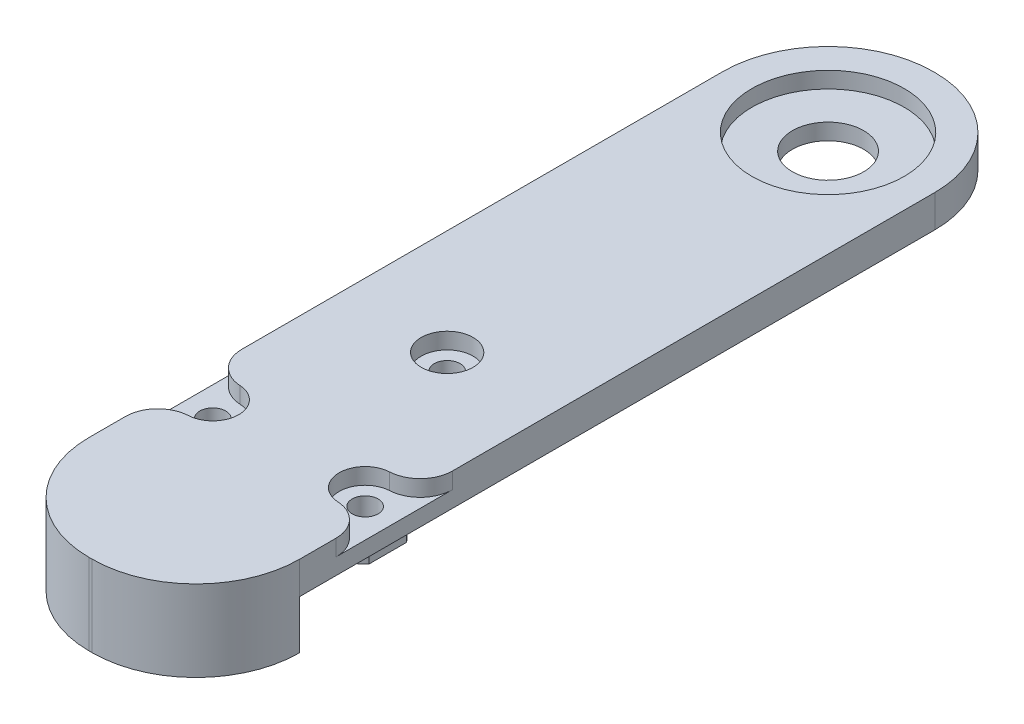
ISO-10303-21;
HEADER;
FILE_DESCRIPTION(('STEP AP214'),'2;1');
FILE_NAME('part.step','',(''),(''),'','','');
FILE_SCHEMA(('AUTOMOTIVE_DESIGN { 1 0 10303 214 1 1 1 1 }'));
ENDSEC;
DATA;
#1=APPLICATION_CONTEXT('core data for automotive mechanical design processes');
#2=APPLICATION_PROTOCOL_DEFINITION('international standard','automotive_design',2000,#1);
#3=PRODUCT_CONTEXT('',#1,'mechanical');
#4=PRODUCT('Part','Part','',(#3));
#5=PRODUCT_RELATED_PRODUCT_CATEGORY('part','',(#4));
#6=PRODUCT_DEFINITION_FORMATION('','',#4);
#7=PRODUCT_DEFINITION_CONTEXT('part definition',#1,'design');
#8=PRODUCT_DEFINITION('design','',#6,#7);
#9=PRODUCT_DEFINITION_SHAPE('','',#8);
#10=(LENGTH_UNIT() NAMED_UNIT(*) SI_UNIT(.MILLI.,.METRE.));
#11=(NAMED_UNIT(*) PLANE_ANGLE_UNIT() SI_UNIT($,.RADIAN.));
#12=(NAMED_UNIT(*) SI_UNIT($,.STERADIAN.) SOLID_ANGLE_UNIT());
#13=UNCERTAINTY_MEASURE_WITH_UNIT(LENGTH_MEASURE(1.E-05),#10,'distance_accuracy_value','');
#14=(GEOMETRIC_REPRESENTATION_CONTEXT(3) GLOBAL_UNCERTAINTY_ASSIGNED_CONTEXT((#13)) GLOBAL_UNIT_ASSIGNED_CONTEXT((#10,
#11,#12)) REPRESENTATION_CONTEXT('',''));
#15=CARTESIAN_POINT('',(0.,0.,0.));
#16=DIRECTION('',(0.,0.,1.));
#17=DIRECTION('',(1.,0.,0.));
#18=AXIS2_PLACEMENT_3D('',#15,#16,#17);
#19=CARTESIAN_POINT('',(23.5,-4.,68.8047840861343));
#20=DIRECTION('',(0.,1.,0.));
#21=DIRECTION('',(0.,0.,1.));
#22=AXIS2_PLACEMENT_3D('',#19,#20,#21);
#23=CYLINDRICAL_SURFACE('',#22,4.);
#24=CARTESIAN_POINT('',(23.5,-4.,68.8047840861343));
#25=DIRECTION('',(0.,-1.,0.));
#26=DIRECTION('',(0.,0.,1.));
#27=AXIS2_PLACEMENT_3D('',#24,#25,#26);
#28=CIRCLE('',#27,4.);
#29=CARTESIAN_POINT('',(23.5,-4.,72.8047840861343));
#30=VERTEX_POINT('',#29);
#31=EDGE_CURVE('E241',#30,#30,#28,.T.);
#32=ORIENTED_EDGE('',*,*,#31,.T.);
#33=EDGE_LOOP('',(#32));
#34=FACE_BOUND('',#33,.T.);
#35=CARTESIAN_POINT('',(23.5,5.,68.8047840861343));
#36=DIRECTION('',(0.,1.,0.));
#37=DIRECTION('',(0.,0.,1.));
#38=AXIS2_PLACEMENT_3D('',#35,#36,#37);
#39=CIRCLE('',#38,4.);
#40=CARTESIAN_POINT('',(23.5,5.,72.8047840861343));
#41=VERTEX_POINT('',#40);
#42=EDGE_CURVE('E403',#41,#41,#39,.T.);
#43=ORIENTED_EDGE('',*,*,#42,.T.);
#44=EDGE_LOOP('',(#43));
#45=FACE_BOUND('',#44,.T.);
#46=ADVANCED_FACE('F39',(#34,#45),#23,.F.);
#47=CARTESIAN_POINT('',(0.,10.,20.));
#48=DIRECTION('',(0.,-1.,0.));
#49=DIRECTION('',(0.,0.,-1.));
#50=AXIS2_PLACEMENT_3D('',#47,#48,#49);
#51=CYLINDRICAL_SURFACE('',#50,4.);
#52=CARTESIAN_POINT('',(0.,0.,20.));
#53=DIRECTION('',(0.,-1.,0.));
#54=DIRECTION('',(0.,0.,-1.));
#55=AXIS2_PLACEMENT_3D('',#52,#53,#54);
#56=CIRCLE('',#55,4.);
#57=CARTESIAN_POINT('',(0.,0.,16.));
#58=VERTEX_POINT('',#57);
#59=EDGE_CURVE('E236',#58,#58,#56,.T.);
#60=ORIENTED_EDGE('',*,*,#59,.T.);
#61=EDGE_LOOP('',(#60));
#62=FACE_BOUND('',#61,.T.);
#63=CARTESIAN_POINT('',(0.,5.,20.));
#64=DIRECTION('',(0.,1.,0.));
#65=DIRECTION('',(0.,0.,1.));
#66=AXIS2_PLACEMENT_3D('',#63,#64,#65);
#67=CIRCLE('',#66,4.);
#68=CARTESIAN_POINT('',(0.,5.,24.));
#69=VERTEX_POINT('',#68);
#70=EDGE_CURVE('E399',#69,#69,#67,.F.);
#71=ORIENTED_EDGE('',*,*,#70,.F.);
#72=EDGE_LOOP('',(#71));
#73=FACE_BOUND('',#72,.T.);
#74=ADVANCED_FACE('F576',(#62,#73),#51,.F.);
#75=CARTESIAN_POINT('',(0.,0.,-97.5));
#76=DIRECTION('',(0.,1.,0.));
#77=DIRECTION('',(0.,0.,1.));
#78=AXIS2_PLACEMENT_3D('',#75,#76,#77);
#79=PLANE('',#78);
#80=CARTESIAN_POINT('',(0.,0.,-97.5));
#81=DIRECTION('',(0.,1.,0.));
#82=DIRECTION('',(0.,0.,1.));
#83=AXIS2_PLACEMENT_3D('',#80,#81,#82);
#84=CIRCLE('',#83,11.);
#85=CARTESIAN_POINT('',(0.,0.,-86.5));
#86=VERTEX_POINT('',#85);
#87=EDGE_CURVE('E309',#86,#86,#84,.T.);
#88=ORIENTED_EDGE('',*,*,#87,.T.);
#89=EDGE_LOOP('',(#88));
#90=FACE_BOUND('',#89,.T.);
#91=CARTESIAN_POINT('',(0.,0.,48.75));
#92=DIRECTION('',(0.,-1.,0.));
#93=DIRECTION('',(0.,0.,-1.));
#94=AXIS2_PLACEMENT_3D('',#91,#92,#93);
#95=CIRCLE('',#94,8.);
#96=CARTESIAN_POINT('',(0.,0.,40.75));
#97=VERTEX_POINT('',#96);
#98=EDGE_CURVE('E300',#97,#97,#95,.T.);
#99=ORIENTED_EDGE('',*,*,#98,.F.);
#100=EDGE_LOOP('',(#99));
#101=FACE_BOUND('',#100,.T.);
#102=CARTESIAN_POINT('',(-23.5,0.,68.8047840861343));
#103=DIRECTION('',(0.,-1.,0.));
#104=DIRECTION('',(0.,0.,-1.));
#105=AXIS2_PLACEMENT_3D('',#102,#103,#104);
#106=CIRCLE('',#105,9.09814427655968);
#107=CARTESIAN_POINT('',(-30.5,0.,62.9930520485146));
#108=VERTEX_POINT('',#107);
#109=CARTESIAN_POINT('',(-30.5,0.,74.6165161237541));
#110=VERTEX_POINT('',#109);
#111=EDGE_CURVE('E277',#108,#110,#106,.T.);
#112=ORIENTED_EDGE('',*,*,#111,.F.);
#113=DIRECTION('',(0.,0.,-1.));
#114=VECTOR('',#113,1.);
#115=CARTESIAN_POINT('',(-30.5,0.,74.6165161237541));
#116=LINE('',#115,#114);
#117=EDGE_CURVE('E283',#110,#108,#116,.T.);
#118=ORIENTED_EDGE('',*,*,#117,.F.);
#119=EDGE_LOOP('',(#112,#118));
#120=FACE_BOUND('',#119,.T.);
#121=CARTESIAN_POINT('',(23.5,0.,68.8047840861343));
#122=DIRECTION('',(0.,-1.,0.));
#123=DIRECTION('',(0.,0.,1.));
#124=AXIS2_PLACEMENT_3D('',#121,#122,#123);
#125=CIRCLE('',#124,9.09814427655968);
#126=CARTESIAN_POINT('',(30.5,0.,74.6165161237541));
#127=VERTEX_POINT('',#126);
#128=CARTESIAN_POINT('',(30.5,0.,62.9930520485146));
#129=VERTEX_POINT('',#128);
#130=EDGE_CURVE('E250',#127,#129,#125,.T.);
#131=ORIENTED_EDGE('',*,*,#130,.F.);
#132=DIRECTION('',(0.,0.,1.));
#133=VECTOR('',#132,1.);
#134=CARTESIAN_POINT('',(30.5,0.,74.6165161237541));
#135=LINE('',#134,#133);
#136=EDGE_CURVE('E256',#129,#127,#135,.T.);
#137=ORIENTED_EDGE('',*,*,#136,.F.);
#138=EDGE_LOOP('',(#131,#137));
#139=FACE_BOUND('',#138,.T.);
#140=ORIENTED_EDGE('',*,*,#59,.F.);
#141=EDGE_LOOP('',(#140));
#142=FACE_BOUND('',#141,.T.);
#143=DIRECTION('',(1.,0.,0.));
#144=VECTOR('',#143,1.);
#145=CARTESIAN_POINT('',(-32.5,0.,97.9999999999998));
#146=LINE('',#145,#144);
#147=CARTESIAN_POINT('',(-32.5,0.,97.9999999999998));
#148=VERTEX_POINT('',#147);
#149=CARTESIAN_POINT('',(-30.5,0.,97.9999999999998));
#150=VERTEX_POINT('',#149);
#151=EDGE_CURVE('E412',#148,#150,#146,.T.);
#152=ORIENTED_EDGE('',*,*,#151,.F.);
#153=DIRECTION('',(0.,0.,1.));
#154=VECTOR('',#153,1.);
#155=CARTESIAN_POINT('',(-32.5,0.,-97.4999999999998));
#156=LINE('',#155,#154);
#157=CARTESIAN_POINT('',(-32.5,0.,-97.4999999999998));
#158=VERTEX_POINT('',#157);
#159=EDGE_CURVE('E359',#158,#148,#156,.T.);
#160=ORIENTED_EDGE('',*,*,#159,.F.);
#161=CARTESIAN_POINT('',(0.,0.,-97.5));
#162=DIRECTION('',(0.,1.,0.));
#163=DIRECTION('',(0.,0.,1.));
#164=AXIS2_PLACEMENT_3D('',#161,#162,#163);
#165=CIRCLE('',#164,32.5);
#166=CARTESIAN_POINT('',(2.0122792321331E-13,0.,-130.));
#167=VERTEX_POINT('',#166);
#168=EDGE_CURVE('E321',#167,#158,#165,.T.);
#169=ORIENTED_EDGE('',*,*,#168,.F.);
#170=DIRECTION('',(-1.,0.,0.));
#171=VECTOR('',#170,1.);
#172=CARTESIAN_POINT('',(2.0122792321331E-13,0.,-130.));
#173=LINE('',#172,#171);
#174=CARTESIAN_POINT('',(0.499999999999758,0.,-130.));
#175=VERTEX_POINT('',#174);
#176=EDGE_CURVE('E330',#175,#167,#173,.T.);
#177=ORIENTED_EDGE('',*,*,#176,.F.);
#178=CARTESIAN_POINT('',(0.49999999999998,0.,-98.));
#179=DIRECTION('',(0.,1.,0.));
#180=DIRECTION('',(0.,0.,-1.));
#181=AXIS2_PLACEMENT_3D('',#178,#179,#180);
#182=CIRCLE('',#181,32.);
#183=CARTESIAN_POINT('',(32.5,0.,-97.9999999999998));
#184=VERTEX_POINT('',#183);
#185=EDGE_CURVE('E366',#184,#175,#182,.T.);
#186=ORIENTED_EDGE('',*,*,#185,.F.);
#187=DIRECTION('',(0.,0.,-1.));
#188=VECTOR('',#187,1.);
#189=CARTESIAN_POINT('',(32.5,0.,-97.9999999999998));
#190=LINE('',#189,#188);
#191=CARTESIAN_POINT('',(32.5,0.,97.9999999999998));
#192=VERTEX_POINT('',#191);
#193=EDGE_CURVE('E363',#192,#184,#190,.T.);
#194=ORIENTED_EDGE('',*,*,#193,.F.);
#195=DIRECTION('',(1.,0.,0.));
#196=VECTOR('',#195,1.);
#197=CARTESIAN_POINT('',(30.5,0.,97.9999999999998));
#198=LINE('',#197,#196);
#199=CARTESIAN_POINT('',(30.5,0.,97.9999999999998));
#200=VERTEX_POINT('',#199);
#201=EDGE_CURVE('E228',#200,#192,#198,.T.);
#202=ORIENTED_EDGE('',*,*,#201,.F.);
#203=CARTESIAN_POINT('',(0.500000000000014,0.,98.));
#204=DIRECTION('',(0.,1.,0.));
#205=DIRECTION('',(0.,0.,-1.));
#206=AXIS2_PLACEMENT_3D('',#203,#204,#205);
#207=CIRCLE('',#206,30.);
#208=CARTESIAN_POINT('',(0.499999999999805,0.,128.));
#209=VERTEX_POINT('',#208);
#210=EDGE_CURVE('E535',#209,#200,#207,.T.);
#211=ORIENTED_EDGE('',*,*,#210,.F.);
#212=DIRECTION('',(1.,0.,0.));
#213=VECTOR('',#212,1.);
#214=CARTESIAN_POINT('',(-0.499999999999772,0.,128.));
#215=LINE('',#214,#213);
#216=CARTESIAN_POINT('',(-0.499999999999772,0.,128.));
#217=VERTEX_POINT('',#216);
#218=EDGE_CURVE('E532',#217,#209,#215,.T.);
#219=ORIENTED_EDGE('',*,*,#218,.F.);
#220=CARTESIAN_POINT('',(-0.499999999999994,0.,98.));
#221=DIRECTION('',(0.,1.,0.));
#222=DIRECTION('',(0.,0.,-1.));
#223=AXIS2_PLACEMENT_3D('',#220,#221,#222);
#224=CIRCLE('',#223,30.);
#225=EDGE_CURVE('E529',#150,#217,#224,.T.);
#226=ORIENTED_EDGE('',*,*,#225,.F.);
#227=EDGE_LOOP('',(#152,#160,#169,#177,#186,#194,#202,#211,#219,#226));
#228=FACE_BOUND('',#227,.T.);
#229=ADVANCED_FACE('F490',(#90,#101,#120,#139,#142,#228),#79,.F.);
#230=CARTESIAN_POINT('',(0.,10.,-97.5));
#231=DIRECTION('',(0.,-1.,0.));
#232=DIRECTION('',(0.,0.,-1.));
#233=AXIS2_PLACEMENT_3D('',#230,#231,#232);
#234=CYLINDRICAL_SURFACE('',#233,32.5);
#235=ORIENTED_EDGE('',*,*,#168,.T.);
#236=DIRECTION('',(0.,-1.,0.));
#237=VECTOR('',#236,1.);
#238=CARTESIAN_POINT('',(-32.5,10.,-97.4999999999998));
#239=LINE('',#238,#237);
#240=CARTESIAN_POINT('',(-32.5,10.,-97.4999999999998));
#241=VERTEX_POINT('',#240);
#242=EDGE_CURVE('E394',#241,#158,#239,.T.);
#243=ORIENTED_EDGE('',*,*,#242,.F.);
#244=CARTESIAN_POINT('',(0.,10.,-97.5));
#245=DIRECTION('',(0.,1.,0.));
#246=DIRECTION('',(0.,0.,1.));
#247=AXIS2_PLACEMENT_3D('',#244,#245,#246);
#248=CIRCLE('',#247,32.5);
#249=CARTESIAN_POINT('',(2.0122792321331E-13,10.,-130.));
#250=VERTEX_POINT('',#249);
#251=EDGE_CURVE('E325',#250,#241,#248,.T.);
#252=ORIENTED_EDGE('',*,*,#251,.F.);
#253=DIRECTION('',(0.,-1.,0.));
#254=VECTOR('',#253,1.);
#255=CARTESIAN_POINT('',(2.0122792321331E-13,10.,-130.));
#256=LINE('',#255,#254);
#257=EDGE_CURVE('E355',#250,#167,#256,.T.);
#258=ORIENTED_EDGE('',*,*,#257,.T.);
#259=EDGE_LOOP('',(#235,#243,#252,#258));
#260=FACE_BOUND('',#259,.T.);
#261=ADVANCED_FACE('F639',(#260),#234,.T.);
#262=CARTESIAN_POINT('',(-32.5,10.,-97.4999999999998));
#263=DIRECTION('',(1.,0.,0.));
#264=DIRECTION('',(0.,0.,-1.));
#265=AXIS2_PLACEMENT_3D('',#262,#263,#264);
#266=PLANE('',#265);
#267=DIRECTION('',(0.,0.,1.));
#268=VECTOR('',#267,1.);
#269=CARTESIAN_POINT('',(-32.5,10.,-97.4999999999998));
#270=LINE('',#269,#268);
#271=CARTESIAN_POINT('',(-32.5,10.,86.7769848417458));
#272=VERTEX_POINT('',#271);
#273=CARTESIAN_POINT('',(-32.5,10.,97.9999999999998));
#274=VERTEX_POINT('',#273);
#275=EDGE_CURVE('E329',#272,#274,#270,.T.);
#276=ORIENTED_EDGE('',*,*,#275,.F.);
#277=DIRECTION('',(0.,1.,0.));
#278=VECTOR('',#277,1.);
#279=CARTESIAN_POINT('',(-32.5,10.,86.7769848417458));
#280=LINE('',#279,#278);
#281=CARTESIAN_POINT('',(-32.5,5.,86.7769848417458));
#282=VERTEX_POINT('',#281);
#283=EDGE_CURVE('E429',#272,#282,#280,.F.);
#284=ORIENTED_EDGE('',*,*,#283,.T.);
#285=DIRECTION('',(0.,0.,1.));
#286=VECTOR('',#285,1.);
#287=CARTESIAN_POINT('',(-32.5,5.,60.8047840861343));
#288=LINE('',#287,#286);
#289=CARTESIAN_POINT('',(-32.5,5.,50.8325833305229));
#290=VERTEX_POINT('',#289);
#291=EDGE_CURVE('E404',#290,#282,#288,.T.);
#292=ORIENTED_EDGE('',*,*,#291,.F.);
#293=DIRECTION('',(0.,1.,0.));
#294=VECTOR('',#293,1.);
#295=CARTESIAN_POINT('',(-32.5,10.,50.8325833305229));
#296=LINE('',#295,#294);
#297=CARTESIAN_POINT('',(-32.5,10.,50.8325833305229));
#298=VERTEX_POINT('',#297);
#299=EDGE_CURVE('E425',#290,#298,#296,.T.);
#300=ORIENTED_EDGE('',*,*,#299,.T.);
#301=EDGE_CURVE('E331',#241,#298,#270,.T.);
#302=ORIENTED_EDGE('',*,*,#301,.F.);
#303=ORIENTED_EDGE('',*,*,#242,.T.);
#304=ORIENTED_EDGE('',*,*,#159,.T.);
#305=DIRECTION('',(0.,-1.,0.));
#306=VECTOR('',#305,1.);
#307=CARTESIAN_POINT('',(-32.5,10.,97.9999999999998));
#308=LINE('',#307,#306);
#309=EDGE_CURVE('E234',#274,#148,#308,.T.);
#310=ORIENTED_EDGE('',*,*,#309,.F.);
#311=EDGE_LOOP('',(#276,#284,#292,#300,#302,#303,#304,#310));
#312=FACE_BOUND('',#311,.T.);
#313=ADVANCED_FACE('F512',(#312),#266,.F.);
#314=CARTESIAN_POINT('',(-0.499999999999994,10.,98.));
#315=DIRECTION('',(0.,-1.,0.));
#316=DIRECTION('',(0.,0.,-1.));
#317=AXIS2_PLACEMENT_3D('',#314,#315,#316);
#318=CYLINDRICAL_SURFACE('',#317,32.);
#319=ORIENTED_EDGE('',*,*,#309,.T.);
#320=DIRECTION('',(0.,1.,0.));
#321=VECTOR('',#320,1.);
#322=CARTESIAN_POINT('',(-32.5,-15.,97.9999999999998));
#323=LINE('',#322,#321);
#324=CARTESIAN_POINT('',(-32.5,-15.,97.9999999999998));
#325=VERTEX_POINT('',#324);
#326=EDGE_CURVE('E209',#325,#148,#323,.T.);
#327=ORIENTED_EDGE('',*,*,#326,.F.);
#328=CARTESIAN_POINT('',(-0.499999999999994,-15.,98.));
#329=DIRECTION('',(0.,-1.,0.));
#330=DIRECTION('',(0.,0.,-1.));
#331=AXIS2_PLACEMENT_3D('',#328,#329,#330);
#332=CIRCLE('',#331,32.);
#333=CARTESIAN_POINT('',(-0.499999999999758,-15.,130.));
#334=VERTEX_POINT('',#333);
#335=EDGE_CURVE('E217',#334,#325,#332,.T.);
#336=ORIENTED_EDGE('',*,*,#335,.F.);
#337=DIRECTION('',(0.,-1.,0.));
#338=VECTOR('',#337,1.);
#339=CARTESIAN_POINT('',(-0.499999999999758,10.,130.));
#340=LINE('',#339,#338);
#341=CARTESIAN_POINT('',(-0.499999999999758,10.,130.));
#342=VERTEX_POINT('',#341);
#343=EDGE_CURVE('E389',#342,#334,#340,.T.);
#344=ORIENTED_EDGE('',*,*,#343,.F.);
#345=CARTESIAN_POINT('',(-0.499999999999994,10.,98.));
#346=DIRECTION('',(0.,1.,0.));
#347=DIRECTION('',(0.,0.,1.));
#348=AXIS2_PLACEMENT_3D('',#345,#346,#347);
#349=CIRCLE('',#348,32.);
#350=EDGE_CURVE('E335',#274,#342,#349,.T.);
#351=ORIENTED_EDGE('',*,*,#350,.F.);
#352=EDGE_LOOP('',(#319,#327,#336,#344,#351));
#353=FACE_BOUND('',#352,.T.);
#354=ADVANCED_FACE('F231',(#353),#318,.T.);
#355=CARTESIAN_POINT('',(-0.499999999999758,10.,130.));
#356=DIRECTION('',(0.,0.,-1.));
#357=DIRECTION('',(-1.,0.,0.));
#358=AXIS2_PLACEMENT_3D('',#355,#356,#357);
#359=PLANE('',#358);
#360=ORIENTED_EDGE('',*,*,#343,.T.);
#361=DIRECTION('',(-1.,0.,0.));
#362=VECTOR('',#361,1.);
#363=CARTESIAN_POINT('',(-0.499999999999758,-15.,130.));
#364=LINE('',#363,#362);
#365=CARTESIAN_POINT('',(0.499999999999787,-15.,130.));
#366=VERTEX_POINT('',#365);
#367=EDGE_CURVE('E224',#366,#334,#364,.T.);
#368=ORIENTED_EDGE('',*,*,#367,.F.);
#369=DIRECTION('',(0.,-1.,0.));
#370=VECTOR('',#369,1.);
#371=CARTESIAN_POINT('',(0.499999999999787,10.,130.));
#372=LINE('',#371,#370);
#373=CARTESIAN_POINT('',(0.499999999999787,10.,130.));
#374=VERTEX_POINT('',#373);
#375=EDGE_CURVE('E386',#374,#366,#372,.T.);
#376=ORIENTED_EDGE('',*,*,#375,.F.);
#377=DIRECTION('',(1.,0.,0.));
#378=VECTOR('',#377,1.);
#379=CARTESIAN_POINT('',(-0.499999999999758,10.,130.));
#380=LINE('',#379,#378);
#381=EDGE_CURVE('E338',#342,#374,#380,.T.);
#382=ORIENTED_EDGE('',*,*,#381,.F.);
#383=EDGE_LOOP('',(#360,#368,#376,#382));
#384=FACE_BOUND('',#383,.T.);
#385=ADVANCED_FACE('F514',(#384),#359,.F.);
#386=CARTESIAN_POINT('',(0.500000000000014,10.,98.));
#387=DIRECTION('',(0.,-1.,0.));
#388=DIRECTION('',(0.,0.,-1.));
#389=AXIS2_PLACEMENT_3D('',#386,#387,#388);
#390=CYLINDRICAL_SURFACE('',#389,32.);
#391=ORIENTED_EDGE('',*,*,#375,.T.);
#392=CARTESIAN_POINT('',(0.500000000000014,-15.,98.));
#393=DIRECTION('',(0.,-1.,0.));
#394=DIRECTION('',(0.,0.,-1.));
#395=AXIS2_PLACEMENT_3D('',#392,#393,#394);
#396=CIRCLE('',#395,32.);
#397=CARTESIAN_POINT('',(32.5,-15.,97.9999999999998));
#398=VERTEX_POINT('',#397);
#399=EDGE_CURVE('E515',#398,#366,#396,.T.);
#400=ORIENTED_EDGE('',*,*,#399,.F.);
#401=DIRECTION('',(0.,1.,0.));
#402=VECTOR('',#401,1.);
#403=CARTESIAN_POINT('',(32.5,-15.,97.9999999999998));
#404=LINE('',#403,#402);
#405=EDGE_CURVE('E484',#398,#192,#404,.T.);
#406=ORIENTED_EDGE('',*,*,#405,.T.);
#407=DIRECTION('',(0.,-1.,0.));
#408=VECTOR('',#407,1.);
#409=CARTESIAN_POINT('',(32.5,10.,97.9999999999998));
#410=LINE('',#409,#408);
#411=CARTESIAN_POINT('',(32.5,10.,97.9999999999998));
#412=VERTEX_POINT('',#411);
#413=EDGE_CURVE('E382',#412,#192,#410,.T.);
#414=ORIENTED_EDGE('',*,*,#413,.F.);
#415=CARTESIAN_POINT('',(0.500000000000014,10.,98.));
#416=DIRECTION('',(0.,1.,0.));
#417=DIRECTION('',(0.,0.,1.));
#418=AXIS2_PLACEMENT_3D('',#415,#416,#417);
#419=CIRCLE('',#418,32.);
#420=EDGE_CURVE('E341',#374,#412,#419,.T.);
#421=ORIENTED_EDGE('',*,*,#420,.F.);
#422=EDGE_LOOP('',(#391,#400,#406,#414,#421));
#423=FACE_BOUND('',#422,.T.);
#424=ADVANCED_FACE('F481',(#423),#390,.T.);
#425=CARTESIAN_POINT('',(32.5,10.,-97.9999999999998));
#426=DIRECTION('',(-1.,0.,0.));
#427=DIRECTION('',(0.,0.,1.));
#428=AXIS2_PLACEMENT_3D('',#425,#426,#427);
#429=PLANE('',#428);
#430=DIRECTION('',(0.,0.,-1.));
#431=VECTOR('',#430,1.);
#432=CARTESIAN_POINT('',(32.5,5.,60.8047840861343));
#433=LINE('',#432,#431);
#434=CARTESIAN_POINT('',(32.5,5.,86.7769848417458));
#435=VERTEX_POINT('',#434);
#436=CARTESIAN_POINT('',(32.5,5.,50.8325833305229));
#437=VERTEX_POINT('',#436);
#438=EDGE_CURVE('E464',#435,#437,#433,.T.);
#439=ORIENTED_EDGE('',*,*,#438,.F.);
#440=DIRECTION('',(0.,1.,0.));
#441=VECTOR('',#440,1.);
#442=CARTESIAN_POINT('',(32.5,10.,86.7769848417458));
#443=LINE('',#442,#441);
#444=CARTESIAN_POINT('',(32.5,10.,86.7769848417458));
#445=VERTEX_POINT('',#444);
#446=EDGE_CURVE('E444',#435,#445,#443,.T.);
#447=ORIENTED_EDGE('',*,*,#446,.T.);
#448=DIRECTION('',(0.,0.,-1.));
#449=VECTOR('',#448,1.);
#450=CARTESIAN_POINT('',(32.5,10.,-97.9999999999998));
#451=LINE('',#450,#449);
#452=EDGE_CURVE('E345',#412,#445,#451,.T.);
#453=ORIENTED_EDGE('',*,*,#452,.F.);
#454=ORIENTED_EDGE('',*,*,#413,.T.);
#455=ORIENTED_EDGE('',*,*,#193,.T.);
#456=DIRECTION('',(0.,-1.,0.));
#457=VECTOR('',#456,1.);
#458=CARTESIAN_POINT('',(32.5,10.,-97.9999999999998));
#459=LINE('',#458,#457);
#460=CARTESIAN_POINT('',(32.5,10.,-97.9999999999998));
#461=VERTEX_POINT('',#460);
#462=EDGE_CURVE('E378',#461,#184,#459,.T.);
#463=ORIENTED_EDGE('',*,*,#462,.F.);
#464=CARTESIAN_POINT('',(32.5,10.,50.8325833305229));
#465=VERTEX_POINT('',#464);
#466=EDGE_CURVE('E344',#465,#461,#451,.T.);
#467=ORIENTED_EDGE('',*,*,#466,.F.);
#468=DIRECTION('',(0.,1.,0.));
#469=VECTOR('',#468,1.);
#470=CARTESIAN_POINT('',(32.5,10.,50.8325833305229));
#471=LINE('',#470,#469);
#472=EDGE_CURVE('E440',#465,#437,#471,.F.);
#473=ORIENTED_EDGE('',*,*,#472,.T.);
#474=EDGE_LOOP('',(#439,#447,#453,#454,#455,#463,#467,#473));
#475=FACE_BOUND('',#474,.T.);
#476=ADVANCED_FACE('F470',(#475),#429,.F.);
#477=CARTESIAN_POINT('',(0.49999999999998,10.,-98.));
#478=DIRECTION('',(0.,-1.,0.));
#479=DIRECTION('',(0.,0.,-1.));
#480=AXIS2_PLACEMENT_3D('',#477,#478,#479);
#481=CYLINDRICAL_SURFACE('',#480,32.);
#482=ORIENTED_EDGE('',*,*,#185,.T.);
#483=DIRECTION('',(0.,-1.,0.));
#484=VECTOR('',#483,1.);
#485=CARTESIAN_POINT('',(0.499999999999758,10.,-130.));
#486=LINE('',#485,#484);
#487=CARTESIAN_POINT('',(0.499999999999758,10.,-130.));
#488=VERTEX_POINT('',#487);
#489=EDGE_CURVE('E374',#488,#175,#486,.T.);
#490=ORIENTED_EDGE('',*,*,#489,.F.);
#491=CARTESIAN_POINT('',(0.49999999999998,10.,-98.));
#492=DIRECTION('',(0.,1.,0.));
#493=DIRECTION('',(0.,0.,-1.));
#494=AXIS2_PLACEMENT_3D('',#491,#492,#493);
#495=CIRCLE('',#494,32.);
#496=EDGE_CURVE('E349',#461,#488,#495,.T.);
#497=ORIENTED_EDGE('',*,*,#496,.F.);
#498=ORIENTED_EDGE('',*,*,#462,.T.);
#499=EDGE_LOOP('',(#482,#490,#497,#498));
#500=FACE_BOUND('',#499,.T.);
#501=ADVANCED_FACE('F496',(#500),#481,.T.);
#502=CARTESIAN_POINT('',(2.0122792321331E-13,10.,-130.));
#503=DIRECTION('',(0.,0.,1.));
#504=DIRECTION('',(1.,0.,0.));
#505=AXIS2_PLACEMENT_3D('',#502,#503,#504);
#506=PLANE('',#505);
#507=ORIENTED_EDGE('',*,*,#176,.T.);
#508=ORIENTED_EDGE('',*,*,#257,.F.);
#509=DIRECTION('',(-1.,0.,0.));
#510=VECTOR('',#509,1.);
#511=CARTESIAN_POINT('',(2.0122792321331E-13,10.,-130.));
#512=LINE('',#511,#510);
#513=EDGE_CURVE('E352',#488,#250,#512,.T.);
#514=ORIENTED_EDGE('',*,*,#513,.F.);
#515=ORIENTED_EDGE('',*,*,#489,.T.);
#516=EDGE_LOOP('',(#507,#508,#514,#515));
#517=FACE_BOUND('',#516,.T.);
#518=ADVANCED_FACE('F500',(#517),#506,.F.);
#519=CARTESIAN_POINT('',(0.,10.,-97.5));
#520=DIRECTION('',(0.,1.,0.));
#521=DIRECTION('',(0.,0.,1.));
#522=AXIS2_PLACEMENT_3D('',#519,#520,#521);
#523=PLANE('',#522);
#524=ORIENTED_EDGE('',*,*,#452,.T.);
#525=CARTESIAN_POINT('',(22.5,10.,86.7769848417458));
#526=DIRECTION('',(0.,1.,0.));
#527=DIRECTION('',(0.,0.,1.));
#528=AXIS2_PLACEMENT_3D('',#525,#526,#527);
#529=CIRCLE('',#528,10.);
#530=CARTESIAN_POINT('',(23.0555555555556,10.,76.7924288664061));
#531=VERTEX_POINT('',#530);
#532=EDGE_CURVE('E451',#445,#531,#529,.T.);
#533=ORIENTED_EDGE('',*,*,#532,.T.);
#534=CARTESIAN_POINT('',(23.5,10.,68.8047840861343));
#535=DIRECTION('',(0.,1.,0.));
#536=DIRECTION('',(0.,0.,1.));
#537=AXIS2_PLACEMENT_3D('',#534,#535,#536);
#538=CIRCLE('',#537,8.);
#539=CARTESIAN_POINT('',(23.0555555555556,10.,60.8171393058626));
#540=VERTEX_POINT('',#539);
#541=EDGE_CURVE('E675',#540,#531,#538,.T.);
#542=ORIENTED_EDGE('',*,*,#541,.F.);
#543=CARTESIAN_POINT('',(22.5,10.,50.8325833305229));
#544=DIRECTION('',(0.,1.,0.));
#545=DIRECTION('',(0.,0.,1.));
#546=AXIS2_PLACEMENT_3D('',#543,#544,#545);
#547=CIRCLE('',#546,10.);
#548=EDGE_CURVE('E448',#540,#465,#547,.T.);
#549=ORIENTED_EDGE('',*,*,#548,.T.);
#550=ORIENTED_EDGE('',*,*,#466,.T.);
#551=ORIENTED_EDGE('',*,*,#496,.T.);
#552=ORIENTED_EDGE('',*,*,#513,.T.);
#553=ORIENTED_EDGE('',*,*,#251,.T.);
#554=ORIENTED_EDGE('',*,*,#301,.T.);
#555=CARTESIAN_POINT('',(-22.5,10.,50.8325833305229));
#556=DIRECTION('',(0.,1.,0.));
#557=DIRECTION('',(0.,0.,1.));
#558=AXIS2_PLACEMENT_3D('',#555,#556,#557);
#559=CIRCLE('',#558,10.);
#560=CARTESIAN_POINT('',(-23.0555555555556,10.,60.8171393058626));
#561=VERTEX_POINT('',#560);
#562=EDGE_CURVE('E419',#298,#561,#559,.T.);
#563=ORIENTED_EDGE('',*,*,#562,.T.);
#564=CARTESIAN_POINT('',(-23.5,10.,68.8047840861343));
#565=DIRECTION('',(0.,1.,0.));
#566=DIRECTION('',(0.,0.,-1.));
#567=AXIS2_PLACEMENT_3D('',#564,#565,#566);
#568=CIRCLE('',#567,8.);
#569=CARTESIAN_POINT('',(-23.0555555555556,10.,76.7924288664061));
#570=VERTEX_POINT('',#569);
#571=EDGE_CURVE('E976',#570,#561,#568,.T.);
#572=ORIENTED_EDGE('',*,*,#571,.F.);
#573=CARTESIAN_POINT('',(-22.5,10.,86.7769848417458));
#574=DIRECTION('',(0.,1.,0.));
#575=DIRECTION('',(0.,0.,1.));
#576=AXIS2_PLACEMENT_3D('',#573,#574,#575);
#577=CIRCLE('',#576,10.);
#578=EDGE_CURVE('E422',#570,#272,#577,.T.);
#579=ORIENTED_EDGE('',*,*,#578,.T.);
#580=ORIENTED_EDGE('',*,*,#275,.T.);
#581=ORIENTED_EDGE('',*,*,#350,.T.);
#582=ORIENTED_EDGE('',*,*,#381,.T.);
#583=ORIENTED_EDGE('',*,*,#420,.T.);
#584=EDGE_LOOP('',(#524,#533,#542,#549,#550,#551,#552,#553,#554,#563,#572,#579,#580,#581,#582,#583));
#585=FACE_BOUND('',#584,.T.);
#586=CARTESIAN_POINT('',(0.,10.,20.));
#587=DIRECTION('',(0.,1.,0.));
#588=DIRECTION('',(0.,0.,1.));
#589=AXIS2_PLACEMENT_3D('',#586,#587,#588);
#590=CIRCLE('',#589,8.);
#591=CARTESIAN_POINT('',(0.,10.,28.));
#592=VERTEX_POINT('',#591);
#593=EDGE_CURVE('E683',#592,#592,#590,.T.);
#594=ORIENTED_EDGE('',*,*,#593,.F.);
#595=EDGE_LOOP('',(#594));
#596=FACE_BOUND('',#595,.T.);
#597=CARTESIAN_POINT('',(0.,10.,-97.5));
#598=DIRECTION('',(0.,1.,0.));
#599=DIRECTION('',(0.,0.,1.));
#600=AXIS2_PLACEMENT_3D('',#597,#598,#599);
#601=CIRCLE('',#600,23.5);
#602=CARTESIAN_POINT('',(0.,10.,-74.));
#603=VERTEX_POINT('',#602);
#604=EDGE_CURVE('E313',#603,#603,#601,.T.);
#605=ORIENTED_EDGE('',*,*,#604,.F.);
#606=EDGE_LOOP('',(#605));
#607=FACE_BOUND('',#606,.T.);
#608=ADVANCED_FACE('F472',(#585,#596,#607),#523,.T.);
#609=CARTESIAN_POINT('',(0.,5.,-97.5));
#610=DIRECTION('',(0.,1.,0.));
#611=DIRECTION('',(0.,0.,1.));
#612=AXIS2_PLACEMENT_3D('',#609,#610,#611);
#613=CYLINDRICAL_SURFACE('',#612,23.5);
#614=CARTESIAN_POINT('',(0.,5.,-97.5));
#615=DIRECTION('',(0.,1.,0.));
#616=DIRECTION('',(0.,0.,1.));
#617=AXIS2_PLACEMENT_3D('',#614,#615,#616);
#618=CIRCLE('',#617,23.5);
#619=CARTESIAN_POINT('',(0.,5.,-74.));
#620=VERTEX_POINT('',#619);
#621=EDGE_CURVE('E317',#620,#620,#618,.T.);
#622=ORIENTED_EDGE('',*,*,#621,.F.);
#623=EDGE_LOOP('',(#622));
#624=FACE_BOUND('',#623,.T.);
#625=ORIENTED_EDGE('',*,*,#604,.T.);
#626=EDGE_LOOP('',(#625));
#627=FACE_BOUND('',#626,.T.);
#628=ADVANCED_FACE('F630',(#624,#627),#613,.F.);
#629=CARTESIAN_POINT('',(0.,5.,-97.5));
#630=DIRECTION('',(0.,1.,0.));
#631=DIRECTION('',(0.,0.,1.));
#632=AXIS2_PLACEMENT_3D('',#629,#630,#631);
#633=PLANE('',#632);
#634=CARTESIAN_POINT('',(0.,5.,-97.5));
#635=DIRECTION('',(0.,1.,0.));
#636=DIRECTION('',(0.,0.,1.));
#637=AXIS2_PLACEMENT_3D('',#634,#635,#636);
#638=CIRCLE('',#637,11.);
#639=CARTESIAN_POINT('',(0.,5.,-86.5));
#640=VERTEX_POINT('',#639);
#641=EDGE_CURVE('E305',#640,#640,#638,.T.);
#642=ORIENTED_EDGE('',*,*,#641,.F.);
#643=EDGE_LOOP('',(#642));
#644=FACE_BOUND('',#643,.T.);
#645=ORIENTED_EDGE('',*,*,#621,.T.);
#646=EDGE_LOOP('',(#645));
#647=FACE_BOUND('',#646,.T.);
#648=ADVANCED_FACE('F626',(#644,#647),#633,.T.);
#649=CARTESIAN_POINT('',(0.,0.,-97.5));
#650=DIRECTION('',(0.,1.,0.));
#651=DIRECTION('',(0.,0.,1.));
#652=AXIS2_PLACEMENT_3D('',#649,#650,#651);
#653=CYLINDRICAL_SURFACE('',#652,11.);
#654=ORIENTED_EDGE('',*,*,#87,.F.);
#655=EDGE_LOOP('',(#654));
#656=FACE_BOUND('',#655,.T.);
#657=ORIENTED_EDGE('',*,*,#641,.T.);
#658=EDGE_LOOP('',(#657));
#659=FACE_BOUND('',#658,.T.);
#660=ADVANCED_FACE('F622',(#656,#659),#653,.F.);
#661=CARTESIAN_POINT('',(0.,4.,48.75));
#662=DIRECTION('',(0.,-1.,0.));
#663=DIRECTION('',(0.,0.,-1.));
#664=AXIS2_PLACEMENT_3D('',#661,#662,#663);
#665=CYLINDRICAL_SURFACE('',#664,8.);
#666=CARTESIAN_POINT('',(0.,4.,48.75));
#667=DIRECTION('',(0.,-1.,0.));
#668=DIRECTION('',(0.,0.,-1.));
#669=AXIS2_PLACEMENT_3D('',#666,#667,#668);
#670=CIRCLE('',#669,8.);
#671=CARTESIAN_POINT('',(0.,4.,40.75));
#672=VERTEX_POINT('',#671);
#673=EDGE_CURVE('E301',#672,#672,#670,.T.);
#674=ORIENTED_EDGE('',*,*,#673,.F.);
#675=EDGE_LOOP('',(#674));
#676=FACE_BOUND('',#675,.T.);
#677=ORIENTED_EDGE('',*,*,#98,.T.);
#678=EDGE_LOOP('',(#677));
#679=FACE_BOUND('',#678,.T.);
#680=ADVANCED_FACE('F618',(#676,#679),#665,.F.);
#681=CARTESIAN_POINT('',(0.,4.,48.75));
#682=DIRECTION('',(0.,-1.,0.));
#683=DIRECTION('',(0.,0.,-1.));
#684=AXIS2_PLACEMENT_3D('',#681,#682,#683);
#685=PLANE('',#684);
#686=ORIENTED_EDGE('',*,*,#673,.T.);
#687=EDGE_LOOP('',(#686));
#688=FACE_BOUND('',#687,.T.);
#689=ADVANCED_FACE('F608',(#688),#685,.T.);
#690=CARTESIAN_POINT('',(-23.5,-4.,68.8047840861343));
#691=DIRECTION('',(0.,-1.,0.));
#692=DIRECTION('',(0.,0.,-1.));
#693=AXIS2_PLACEMENT_3D('',#690,#691,#692);
#694=PLANE('',#693);
#695=CARTESIAN_POINT('',(-23.5,-4.,68.8047840861343));
#696=DIRECTION('',(0.,-1.,0.));
#697=DIRECTION('',(0.,0.,-1.));
#698=AXIS2_PLACEMENT_3D('',#695,#696,#697);
#699=CIRCLE('',#698,9.09814427655968);
#700=CARTESIAN_POINT('',(-30.5,-4.,62.9930520485146));
#701=VERTEX_POINT('',#700);
#702=CARTESIAN_POINT('',(-30.5,-4.,74.6165161237541));
#703=VERTEX_POINT('',#702);
#704=EDGE_CURVE('E278',#701,#703,#699,.T.);
#705=ORIENTED_EDGE('',*,*,#704,.T.);
#706=DIRECTION('',(0.,0.,-1.));
#707=VECTOR('',#706,1.);
#708=CARTESIAN_POINT('',(-30.5,-4.,74.6165161237541));
#709=LINE('',#708,#707);
#710=EDGE_CURVE('E282',#703,#701,#709,.T.);
#711=ORIENTED_EDGE('',*,*,#710,.T.);
#712=EDGE_LOOP('',(#705,#711));
#713=FACE_BOUND('',#712,.T.);
#714=CARTESIAN_POINT('',(-23.5,-4.,68.8047840861343));
#715=DIRECTION('',(0.,-1.,0.));
#716=DIRECTION('',(0.,0.,-1.));
#717=AXIS2_PLACEMENT_3D('',#714,#715,#716);
#718=CIRCLE('',#717,4.);
#719=CARTESIAN_POINT('',(-23.5,-4.,64.8047840861343));
#720=VERTEX_POINT('',#719);
#721=EDGE_CURVE('E273',#720,#720,#718,.T.);
#722=ORIENTED_EDGE('',*,*,#721,.F.);
#723=EDGE_LOOP('',(#722));
#724=FACE_BOUND('',#723,.T.);
#725=ADVANCED_FACE('F604',(#713,#724),#694,.T.);
#726=CARTESIAN_POINT('',(-23.5,-4.,68.8047840861343));
#727=DIRECTION('',(0.,1.,0.));
#728=DIRECTION('',(0.,0.,1.));
#729=AXIS2_PLACEMENT_3D('',#726,#727,#728);
#730=CYLINDRICAL_SURFACE('',#729,9.09814427655968);
#731=ORIENTED_EDGE('',*,*,#111,.T.);
#732=DIRECTION('',(0.,1.,0.));
#733=VECTOR('',#732,1.);
#734=CARTESIAN_POINT('',(-30.5,-4.,74.6165161237541));
#735=LINE('',#734,#733);
#736=EDGE_CURVE('E296',#703,#110,#735,.T.);
#737=ORIENTED_EDGE('',*,*,#736,.F.);
#738=ORIENTED_EDGE('',*,*,#704,.F.);
#739=DIRECTION('',(0.,1.,0.));
#740=VECTOR('',#739,1.);
#741=CARTESIAN_POINT('',(-30.5,-4.,62.9930520485146));
#742=LINE('',#741,#740);
#743=EDGE_CURVE('E286',#701,#108,#742,.T.);
#744=ORIENTED_EDGE('',*,*,#743,.T.);
#745=EDGE_LOOP('',(#731,#737,#738,#744));
#746=FACE_BOUND('',#745,.T.);
#747=ADVANCED_FACE('F607',(#746),#730,.T.);
#748=CARTESIAN_POINT('',(-30.5,-4.,74.6165161237541));
#749=DIRECTION('',(1.,0.,0.));
#750=DIRECTION('',(0.,0.,-1.));
#751=AXIS2_PLACEMENT_3D('',#748,#749,#750);
#752=PLANE('',#751);
#753=ORIENTED_EDGE('',*,*,#117,.T.);
#754=ORIENTED_EDGE('',*,*,#743,.F.);
#755=ORIENTED_EDGE('',*,*,#710,.F.);
#756=ORIENTED_EDGE('',*,*,#736,.T.);
#757=EDGE_LOOP('',(#753,#754,#755,#756));
#758=FACE_BOUND('',#757,.T.);
#759=ADVANCED_FACE('F602',(#758),#752,.F.);
#760=CARTESIAN_POINT('',(-23.5,-4.,68.8047840861343));
#761=DIRECTION('',(0.,1.,0.));
#762=DIRECTION('',(0.,0.,1.));
#763=AXIS2_PLACEMENT_3D('',#760,#761,#762);
#764=CYLINDRICAL_SURFACE('',#763,4.);
#765=CARTESIAN_POINT('',(-23.5,5.,68.8047840861343));
#766=DIRECTION('',(0.,-1.,0.));
#767=DIRECTION('',(0.,0.,-1.));
#768=AXIS2_PLACEMENT_3D('',#765,#766,#767);
#769=CIRCLE('',#768,4.);
#770=CARTESIAN_POINT('',(-23.5,5.,64.8047840861343));
#771=VERTEX_POINT('',#770);
#772=EDGE_CURVE('E408',#771,#771,#769,.T.);
#773=ORIENTED_EDGE('',*,*,#772,.F.);
#774=EDGE_LOOP('',(#773));
#775=FACE_BOUND('',#774,.T.);
#776=ORIENTED_EDGE('',*,*,#721,.T.);
#777=EDGE_LOOP('',(#776));
#778=FACE_BOUND('',#777,.T.);
#779=ADVANCED_FACE('F591',(#775,#778),#764,.F.);
#780=CARTESIAN_POINT('',(23.5,-4.,68.8047840861343));
#781=DIRECTION('',(0.,1.,0.));
#782=DIRECTION('',(0.,0.,1.));
#783=AXIS2_PLACEMENT_3D('',#780,#781,#782);
#784=PLANE('',#783);
#785=CARTESIAN_POINT('',(23.5,-4.,68.8047840861343));
#786=DIRECTION('',(0.,-1.,0.));
#787=DIRECTION('',(0.,0.,1.));
#788=AXIS2_PLACEMENT_3D('',#785,#786,#787);
#789=CIRCLE('',#788,9.09814427655968);
#790=CARTESIAN_POINT('',(30.5,-4.,74.6165161237541));
#791=VERTEX_POINT('',#790);
#792=CARTESIAN_POINT('',(30.5,-4.,62.9930520485146));
#793=VERTEX_POINT('',#792);
#794=EDGE_CURVE('E251',#791,#793,#789,.T.);
#795=ORIENTED_EDGE('',*,*,#794,.T.);
#796=DIRECTION('',(0.,0.,1.));
#797=VECTOR('',#796,1.);
#798=CARTESIAN_POINT('',(30.5,-4.,74.6165161237541));
#799=LINE('',#798,#797);
#800=EDGE_CURVE('E255',#793,#791,#799,.T.);
#801=ORIENTED_EDGE('',*,*,#800,.T.);
#802=EDGE_LOOP('',(#795,#801));
#803=FACE_BOUND('',#802,.T.);
#804=ORIENTED_EDGE('',*,*,#31,.F.);
#805=EDGE_LOOP('',(#804));
#806=FACE_BOUND('',#805,.T.);
#807=ADVANCED_FACE('F587',(#803,#806),#784,.F.);
#808=CARTESIAN_POINT('',(23.5,-4.,68.8047840861343));
#809=DIRECTION('',(0.,1.,0.));
#810=DIRECTION('',(0.,0.,1.));
#811=AXIS2_PLACEMENT_3D('',#808,#809,#810);
#812=CYLINDRICAL_SURFACE('',#811,9.09814427655968);
#813=ORIENTED_EDGE('',*,*,#130,.T.);
#814=DIRECTION('',(0.,1.,0.));
#815=VECTOR('',#814,1.);
#816=CARTESIAN_POINT('',(30.5,-4.,62.9930520485146));
#817=LINE('',#816,#815);
#818=EDGE_CURVE('E269',#793,#129,#817,.T.);
#819=ORIENTED_EDGE('',*,*,#818,.F.);
#820=ORIENTED_EDGE('',*,*,#794,.F.);
#821=DIRECTION('',(0.,1.,0.));
#822=VECTOR('',#821,1.);
#823=CARTESIAN_POINT('',(30.5,-4.,74.6165161237541));
#824=LINE('',#823,#822);
#825=EDGE_CURVE('E259',#791,#127,#824,.T.);
#826=ORIENTED_EDGE('',*,*,#825,.T.);
#827=EDGE_LOOP('',(#813,#819,#820,#826));
#828=FACE_BOUND('',#827,.T.);
#829=ADVANCED_FACE('F590',(#828),#812,.T.);
#830=CARTESIAN_POINT('',(30.5,-4.,74.6165161237541));
#831=DIRECTION('',(-1.,0.,0.));
#832=DIRECTION('',(0.,0.,1.));
#833=AXIS2_PLACEMENT_3D('',#830,#831,#832);
#834=PLANE('',#833);
#835=ORIENTED_EDGE('',*,*,#136,.T.);
#836=ORIENTED_EDGE('',*,*,#825,.F.);
#837=ORIENTED_EDGE('',*,*,#800,.F.);
#838=ORIENTED_EDGE('',*,*,#818,.T.);
#839=EDGE_LOOP('',(#835,#836,#837,#838));
#840=FACE_BOUND('',#839,.T.);
#841=ADVANCED_FACE('F593',(#840),#834,.F.);
#842=CARTESIAN_POINT('',(-32.5,-15.,97.9999999999998));
#843=DIRECTION('',(0.,0.,1.));
#844=DIRECTION('',(1.,0.,0.));
#845=AXIS2_PLACEMENT_3D('',#842,#843,#844);
#846=PLANE('',#845);
#847=ORIENTED_EDGE('',*,*,#151,.T.);
#848=DIRECTION('',(0.,1.,0.));
#849=VECTOR('',#848,1.);
#850=CARTESIAN_POINT('',(-30.5,-15.,97.9999999999998));
#851=LINE('',#850,#849);
#852=CARTESIAN_POINT('',(-30.5,-15.,97.9999999999998));
#853=VERTEX_POINT('',#852);
#854=EDGE_CURVE('E212',#853,#150,#851,.T.);
#855=ORIENTED_EDGE('',*,*,#854,.F.);
#856=DIRECTION('',(1.,0.,0.));
#857=VECTOR('',#856,1.);
#858=CARTESIAN_POINT('',(-32.5,-15.,97.9999999999998));
#859=LINE('',#858,#857);
#860=EDGE_CURVE('E205',#325,#853,#859,.T.);
#861=ORIENTED_EDGE('',*,*,#860,.F.);
#862=ORIENTED_EDGE('',*,*,#326,.T.);
#863=EDGE_LOOP('',(#847,#855,#861,#862));
#864=FACE_BOUND('',#863,.T.);
#865=ADVANCED_FACE('F207',(#864),#846,.F.);
#866=CARTESIAN_POINT('',(-0.499999999999994,-15.,98.));
#867=DIRECTION('',(0.,1.,0.));
#868=DIRECTION('',(0.,0.,1.));
#869=AXIS2_PLACEMENT_3D('',#866,#867,#868);
#870=CYLINDRICAL_SURFACE('',#869,30.);
#871=ORIENTED_EDGE('',*,*,#225,.T.);
#872=DIRECTION('',(0.,1.,0.));
#873=VECTOR('',#872,1.);
#874=CARTESIAN_POINT('',(-0.499999999999772,-15.,128.));
#875=LINE('',#874,#873);
#876=CARTESIAN_POINT('',(-0.499999999999772,-15.,128.));
#877=VERTEX_POINT('',#876);
#878=EDGE_CURVE('E243',#877,#217,#875,.T.);
#879=ORIENTED_EDGE('',*,*,#878,.F.);
#880=CARTESIAN_POINT('',(-0.499999999999994,-15.,98.));
#881=DIRECTION('',(0.,1.,0.));
#882=DIRECTION('',(0.,0.,-1.));
#883=AXIS2_PLACEMENT_3D('',#880,#881,#882);
#884=CIRCLE('',#883,30.);
#885=EDGE_CURVE('E216',#853,#877,#884,.T.);
#886=ORIENTED_EDGE('',*,*,#885,.F.);
#887=ORIENTED_EDGE('',*,*,#854,.T.);
#888=EDGE_LOOP('',(#871,#879,#886,#887));
#889=FACE_BOUND('',#888,.T.);
#890=ADVANCED_FACE('F694',(#889),#870,.F.);
#891=CARTESIAN_POINT('',(-0.499999999999772,-15.,128.));
#892=DIRECTION('',(0.,0.,1.));
#893=DIRECTION('',(1.,0.,0.));
#894=AXIS2_PLACEMENT_3D('',#891,#892,#893);
#895=PLANE('',#894);
#896=ORIENTED_EDGE('',*,*,#218,.T.);
#897=DIRECTION('',(0.,1.,0.));
#898=VECTOR('',#897,1.);
#899=CARTESIAN_POINT('',(0.499999999999805,-15.,128.));
#900=LINE('',#899,#898);
#901=CARTESIAN_POINT('',(0.499999999999805,-15.,128.));
#902=VERTEX_POINT('',#901);
#903=EDGE_CURVE('E546',#902,#209,#900,.T.);
#904=ORIENTED_EDGE('',*,*,#903,.F.);
#905=DIRECTION('',(1.,0.,0.));
#906=VECTOR('',#905,1.);
#907=CARTESIAN_POINT('',(-0.499999999999772,-15.,128.));
#908=LINE('',#907,#906);
#909=EDGE_CURVE('E557',#877,#902,#908,.T.);
#910=ORIENTED_EDGE('',*,*,#909,.F.);
#911=ORIENTED_EDGE('',*,*,#878,.T.);
#912=EDGE_LOOP('',(#896,#904,#910,#911));
#913=FACE_BOUND('',#912,.T.);
#914=ADVANCED_FACE('F555',(#913),#895,.F.);
#915=CARTESIAN_POINT('',(0.500000000000014,-15.,98.));
#916=DIRECTION('',(0.,1.,0.));
#917=DIRECTION('',(0.,0.,1.));
#918=AXIS2_PLACEMENT_3D('',#915,#916,#917);
#919=CYLINDRICAL_SURFACE('',#918,30.);
#920=ORIENTED_EDGE('',*,*,#210,.T.);
#921=DIRECTION('',(0.,1.,0.));
#922=VECTOR('',#921,1.);
#923=CARTESIAN_POINT('',(30.5,-15.,97.9999999999998));
#924=LINE('',#923,#922);
#925=CARTESIAN_POINT('',(30.5,-15.,97.9999999999998));
#926=VERTEX_POINT('',#925);
#927=EDGE_CURVE('E542',#926,#200,#924,.T.);
#928=ORIENTED_EDGE('',*,*,#927,.F.);
#929=CARTESIAN_POINT('',(0.500000000000014,-15.,98.));
#930=DIRECTION('',(0.,1.,0.));
#931=DIRECTION('',(0.,0.,-1.));
#932=AXIS2_PLACEMENT_3D('',#929,#930,#931);
#933=CIRCLE('',#932,30.);
#934=EDGE_CURVE('E523',#902,#926,#933,.T.);
#935=ORIENTED_EDGE('',*,*,#934,.F.);
#936=ORIENTED_EDGE('',*,*,#903,.T.);
#937=EDGE_LOOP('',(#920,#928,#935,#936));
#938=FACE_BOUND('',#937,.T.);
#939=ADVANCED_FACE('F562',(#938),#919,.F.);
#940=CARTESIAN_POINT('',(30.5,-15.,97.9999999999998));
#941=DIRECTION('',(0.,0.,1.));
#942=DIRECTION('',(1.,0.,0.));
#943=AXIS2_PLACEMENT_3D('',#940,#941,#942);
#944=PLANE('',#943);
#945=ORIENTED_EDGE('',*,*,#201,.T.);
#946=ORIENTED_EDGE('',*,*,#405,.F.);
#947=DIRECTION('',(1.,0.,0.));
#948=VECTOR('',#947,1.);
#949=CARTESIAN_POINT('',(30.5,-15.,97.9999999999998));
#950=LINE('',#949,#948);
#951=EDGE_CURVE('E517',#926,#398,#950,.T.);
#952=ORIENTED_EDGE('',*,*,#951,.F.);
#953=ORIENTED_EDGE('',*,*,#927,.T.);
#954=EDGE_LOOP('',(#945,#946,#952,#953));
#955=FACE_BOUND('',#954,.T.);
#956=ADVANCED_FACE('F565',(#955),#944,.F.);
#957=CARTESIAN_POINT('',(-0.499999999999994,-15.,98.));
#958=DIRECTION('',(0.,-1.,0.));
#959=DIRECTION('',(0.,0.,-1.));
#960=AXIS2_PLACEMENT_3D('',#957,#958,#959);
#961=PLANE('',#960);
#962=ORIENTED_EDGE('',*,*,#335,.T.);
#963=ORIENTED_EDGE('',*,*,#860,.T.);
#964=ORIENTED_EDGE('',*,*,#885,.T.);
#965=ORIENTED_EDGE('',*,*,#909,.T.);
#966=ORIENTED_EDGE('',*,*,#934,.T.);
#967=ORIENTED_EDGE('',*,*,#951,.T.);
#968=ORIENTED_EDGE('',*,*,#399,.T.);
#969=ORIENTED_EDGE('',*,*,#367,.T.);
#970=EDGE_LOOP('',(#962,#963,#964,#965,#966,#967,#968,#969));
#971=FACE_BOUND('',#970,.T.);
#972=ADVANCED_FACE('F221',(#971),#961,.T.);
#973=CARTESIAN_POINT('',(0.,5.,20.));
#974=DIRECTION('',(0.,1.,0.));
#975=DIRECTION('',(0.,0.,1.));
#976=AXIS2_PLACEMENT_3D('',#973,#974,#975);
#977=PLANE('',#976);
#978=CARTESIAN_POINT('',(0.,5.,20.));
#979=DIRECTION('',(0.,1.,0.));
#980=DIRECTION('',(0.,0.,1.));
#981=AXIS2_PLACEMENT_3D('',#978,#979,#980);
#982=CIRCLE('',#981,8.);
#983=CARTESIAN_POINT('',(0.,5.,28.));
#984=VERTEX_POINT('',#983);
#985=EDGE_CURVE('E677',#984,#984,#982,.T.);
#986=ORIENTED_EDGE('',*,*,#985,.T.);
#987=EDGE_LOOP('',(#986));
#988=FACE_BOUND('',#987,.T.);
#989=ORIENTED_EDGE('',*,*,#70,.T.);
#990=EDGE_LOOP('',(#989));
#991=FACE_BOUND('',#990,.T.);
#992=ADVANCED_FACE('F572',(#988,#991),#977,.T.);
#993=CARTESIAN_POINT('',(0.,5.,20.));
#994=DIRECTION('',(0.,1.,0.));
#995=DIRECTION('',(0.,0.,1.));
#996=AXIS2_PLACEMENT_3D('',#993,#994,#995);
#997=CYLINDRICAL_SURFACE('',#996,8.);
#998=ORIENTED_EDGE('',*,*,#985,.F.);
#999=EDGE_LOOP('',(#998));
#1000=FACE_BOUND('',#999,.T.);
#1001=ORIENTED_EDGE('',*,*,#593,.T.);
#1002=EDGE_LOOP('',(#1001));
#1003=FACE_BOUND('',#1002,.T.);
#1004=ADVANCED_FACE('F898',(#1000,#1003),#997,.F.);
#1005=CARTESIAN_POINT('',(23.5,5.,68.8047840861343));
#1006=DIRECTION('',(0.,1.,0.));
#1007=DIRECTION('',(0.,0.,1.));
#1008=AXIS2_PLACEMENT_3D('',#1005,#1006,#1007);
#1009=CYLINDRICAL_SURFACE('',#1008,8.);
#1010=ORIENTED_EDGE('',*,*,#541,.T.);
#1011=DIRECTION('',(0.,1.,0.));
#1012=VECTOR('',#1011,1.);
#1013=CARTESIAN_POINT('',(23.0555555555556,5.,76.7924288664061));
#1014=LINE('',#1013,#1012);
#1015=CARTESIAN_POINT('',(23.0555555555556,5.,76.7924288664061));
#1016=VERTEX_POINT('',#1015);
#1017=EDGE_CURVE('E55',#531,#1016,#1014,.F.);
#1018=ORIENTED_EDGE('',*,*,#1017,.T.);
#1019=CARTESIAN_POINT('',(23.5,5.,68.8047840861343));
#1020=DIRECTION('',(0.,1.,0.));
#1021=DIRECTION('',(0.,0.,1.));
#1022=AXIS2_PLACEMENT_3D('',#1019,#1020,#1021);
#1023=CIRCLE('',#1022,8.);
#1024=CARTESIAN_POINT('',(23.0555555555556,5.,60.8171393058626));
#1025=VERTEX_POINT('',#1024);
#1026=EDGE_CURVE('E465',#1025,#1016,#1023,.T.);
#1027=ORIENTED_EDGE('',*,*,#1026,.F.);
#1028=DIRECTION('',(0.,1.,0.));
#1029=VECTOR('',#1028,1.);
#1030=CARTESIAN_POINT('',(23.0555555555556,5.,60.8171393058626));
#1031=LINE('',#1030,#1029);
#1032=EDGE_CURVE('E454',#1025,#540,#1031,.T.);
#1033=ORIENTED_EDGE('',*,*,#1032,.T.);
#1034=EDGE_LOOP('',(#1010,#1018,#1027,#1033));
#1035=FACE_BOUND('',#1034,.T.);
#1036=ADVANCED_FACE('F674',(#1035),#1009,.F.);
#1037=CARTESIAN_POINT('',(23.5,5.,68.8047840861343));
#1038=DIRECTION('',(0.,1.,0.));
#1039=DIRECTION('',(0.,0.,1.));
#1040=AXIS2_PLACEMENT_3D('',#1037,#1038,#1039);
#1041=PLANE('',#1040);
#1042=ORIENTED_EDGE('',*,*,#42,.F.);
#1043=EDGE_LOOP('',(#1042));
#1044=FACE_BOUND('',#1043,.T.);
#1045=ORIENTED_EDGE('',*,*,#438,.T.);
#1046=CARTESIAN_POINT('',(22.5,5.,50.8325833305229));
#1047=DIRECTION('',(0.,1.,0.));
#1048=DIRECTION('',(0.,0.,1.));
#1049=AXIS2_PLACEMENT_3D('',#1046,#1047,#1048);
#1050=CIRCLE('',#1049,10.);
#1051=EDGE_CURVE('E11',#437,#1025,#1050,.F.);
#1052=ORIENTED_EDGE('',*,*,#1051,.T.);
#1053=ORIENTED_EDGE('',*,*,#1026,.T.);
#1054=CARTESIAN_POINT('',(22.5,5.,86.7769848417458));
#1055=DIRECTION('',(0.,1.,0.));
#1056=DIRECTION('',(0.,0.,1.));
#1057=AXIS2_PLACEMENT_3D('',#1054,#1055,#1056);
#1058=CIRCLE('',#1057,10.);
#1059=EDGE_CURVE('E48',#1016,#435,#1058,.F.);
#1060=ORIENTED_EDGE('',*,*,#1059,.T.);
#1061=EDGE_LOOP('',(#1045,#1052,#1053,#1060));
#1062=FACE_BOUND('',#1061,.T.);
#1063=ADVANCED_FACE('F463',(#1044,#1062),#1041,.T.);
#1064=CARTESIAN_POINT('',(-23.5,5.,68.8047840861343));
#1065=DIRECTION('',(0.,1.,0.));
#1066=DIRECTION('',(0.,0.,1.));
#1067=AXIS2_PLACEMENT_3D('',#1064,#1065,#1066);
#1068=CYLINDRICAL_SURFACE('',#1067,8.);
#1069=CARTESIAN_POINT('',(-23.5,5.,68.8047840861343));
#1070=DIRECTION('',(0.,1.,0.));
#1071=DIRECTION('',(0.,0.,-1.));
#1072=AXIS2_PLACEMENT_3D('',#1069,#1070,#1071);
#1073=CIRCLE('',#1072,8.);
#1074=CARTESIAN_POINT('',(-23.0555555555556,5.,76.7924288664061));
#1075=VERTEX_POINT('',#1074);
#1076=CARTESIAN_POINT('',(-23.0555555555556,5.,60.8171393058626));
#1077=VERTEX_POINT('',#1076);
#1078=EDGE_CURVE('E972',#1075,#1077,#1073,.T.);
#1079=ORIENTED_EDGE('',*,*,#1078,.F.);
#1080=DIRECTION('',(0.,1.,0.));
#1081=VECTOR('',#1080,1.);
#1082=CARTESIAN_POINT('',(-23.0555555555556,5.,76.7924288664061));
#1083=LINE('',#1082,#1081);
#1084=EDGE_CURVE('E415',#1075,#570,#1083,.T.);
#1085=ORIENTED_EDGE('',*,*,#1084,.T.);
#1086=ORIENTED_EDGE('',*,*,#571,.T.);
#1087=DIRECTION('',(0.,1.,0.));
#1088=VECTOR('',#1087,1.);
#1089=CARTESIAN_POINT('',(-23.0555555555556,5.,60.8171393058626));
#1090=LINE('',#1089,#1088);
#1091=EDGE_CURVE('E398',#561,#1077,#1090,.F.);
#1092=ORIENTED_EDGE('',*,*,#1091,.T.);
#1093=EDGE_LOOP('',(#1079,#1085,#1086,#1092));
#1094=FACE_BOUND('',#1093,.T.);
#1095=ADVANCED_FACE('F916',(#1094),#1068,.F.);
#1096=CARTESIAN_POINT('',(-23.5,5.,68.8047840861343));
#1097=DIRECTION('',(0.,-1.,0.));
#1098=DIRECTION('',(0.,0.,-1.));
#1099=AXIS2_PLACEMENT_3D('',#1096,#1097,#1098);
#1100=PLANE('',#1099);
#1101=ORIENTED_EDGE('',*,*,#772,.T.);
#1102=EDGE_LOOP('',(#1101));
#1103=FACE_BOUND('',#1102,.T.);
#1104=ORIENTED_EDGE('',*,*,#291,.T.);
#1105=CARTESIAN_POINT('',(-22.5,5.,86.7769848417458));
#1106=DIRECTION('',(0.,-1.,0.));
#1107=DIRECTION('',(0.,0.,-1.));
#1108=AXIS2_PLACEMENT_3D('',#1105,#1106,#1107);
#1109=CIRCLE('',#1108,10.);
#1110=EDGE_CURVE('E433',#282,#1075,#1109,.T.);
#1111=ORIENTED_EDGE('',*,*,#1110,.T.);
#1112=ORIENTED_EDGE('',*,*,#1078,.T.);
#1113=CARTESIAN_POINT('',(-22.5,5.,50.8325833305229));
#1114=DIRECTION('',(0.,-1.,0.));
#1115=DIRECTION('',(0.,0.,-1.));
#1116=AXIS2_PLACEMENT_3D('',#1113,#1114,#1115);
#1117=CIRCLE('',#1116,10.);
#1118=EDGE_CURVE('E436',#1077,#290,#1117,.T.);
#1119=ORIENTED_EDGE('',*,*,#1118,.T.);
#1120=EDGE_LOOP('',(#1104,#1111,#1112,#1119));
#1121=FACE_BOUND('',#1120,.T.);
#1122=ADVANCED_FACE('F662',(#1103,#1121),#1100,.F.);
#1123=CARTESIAN_POINT('',(-22.5,5.,86.7769848417458));
#1124=DIRECTION('',(0.,1.,0.));
#1125=DIRECTION('',(0.,0.,1.));
#1126=AXIS2_PLACEMENT_3D('',#1123,#1124,#1125);
#1127=CYLINDRICAL_SURFACE('',#1126,10.);
#1128=ORIENTED_EDGE('',*,*,#1110,.F.);
#1129=ORIENTED_EDGE('',*,*,#283,.F.);
#1130=ORIENTED_EDGE('',*,*,#578,.F.);
#1131=ORIENTED_EDGE('',*,*,#1084,.F.);
#1132=EDGE_LOOP('',(#1128,#1129,#1130,#1131));
#1133=FACE_BOUND('',#1132,.T.);
#1134=ADVANCED_FACE('F658',(#1133),#1127,.T.);
#1135=CARTESIAN_POINT('',(-22.5,5.,50.8325833305229));
#1136=DIRECTION('',(0.,1.,0.));
#1137=DIRECTION('',(0.,0.,1.));
#1138=AXIS2_PLACEMENT_3D('',#1135,#1136,#1137);
#1139=CYLINDRICAL_SURFACE('',#1138,10.);
#1140=ORIENTED_EDGE('',*,*,#1118,.F.);
#1141=ORIENTED_EDGE('',*,*,#1091,.F.);
#1142=ORIENTED_EDGE('',*,*,#562,.F.);
#1143=ORIENTED_EDGE('',*,*,#299,.F.);
#1144=EDGE_LOOP('',(#1140,#1141,#1142,#1143));
#1145=FACE_BOUND('',#1144,.T.);
#1146=ADVANCED_FACE('F661',(#1145),#1139,.T.);
#1147=CARTESIAN_POINT('',(22.5,5.,86.7769848417458));
#1148=DIRECTION('',(0.,1.,0.));
#1149=DIRECTION('',(0.,0.,1.));
#1150=AXIS2_PLACEMENT_3D('',#1147,#1148,#1149);
#1151=CYLINDRICAL_SURFACE('',#1150,10.);
#1152=ORIENTED_EDGE('',*,*,#1059,.F.);
#1153=ORIENTED_EDGE('',*,*,#1017,.F.);
#1154=ORIENTED_EDGE('',*,*,#532,.F.);
#1155=ORIENTED_EDGE('',*,*,#446,.F.);
#1156=EDGE_LOOP('',(#1152,#1153,#1154,#1155));
#1157=FACE_BOUND('',#1156,.T.);
#1158=ADVANCED_FACE('F467',(#1157),#1151,.T.);
#1159=CARTESIAN_POINT('',(22.5,5.,50.8325833305229));
#1160=DIRECTION('',(0.,1.,0.));
#1161=DIRECTION('',(0.,0.,1.));
#1162=AXIS2_PLACEMENT_3D('',#1159,#1160,#1161);
#1163=CYLINDRICAL_SURFACE('',#1162,10.);
#1164=ORIENTED_EDGE('',*,*,#1051,.F.);
#1165=ORIENTED_EDGE('',*,*,#472,.F.);
#1166=ORIENTED_EDGE('',*,*,#548,.F.);
#1167=ORIENTED_EDGE('',*,*,#1032,.F.);
#1168=EDGE_LOOP('',(#1164,#1165,#1166,#1167));
#1169=FACE_BOUND('',#1168,.T.);
#1170=ADVANCED_FACE('F41',(#1169),#1163,.T.);
#1171=CLOSED_SHELL('',(#46,#74,#229,#261,#313,#354,#385,#424,#476,#501,#518,#608,#628,#648,#660,
#680,#689,#725,#747,#759,#779,#807,#829,#841,#865,#890,#914,#939,#956,#972,#992,#1004,#1036,
#1063,#1095,#1122,#1134,#1146,#1158,#1170));
#1172=MANIFOLD_SOLID_BREP('B2',#1171);
#1173=ADVANCED_BREP_SHAPE_REPRESENTATION('',(#18,#1172),#14);
#1174=SHAPE_DEFINITION_REPRESENTATION(#9,#1173);
ENDSEC;
END-ISO-10303-21;
